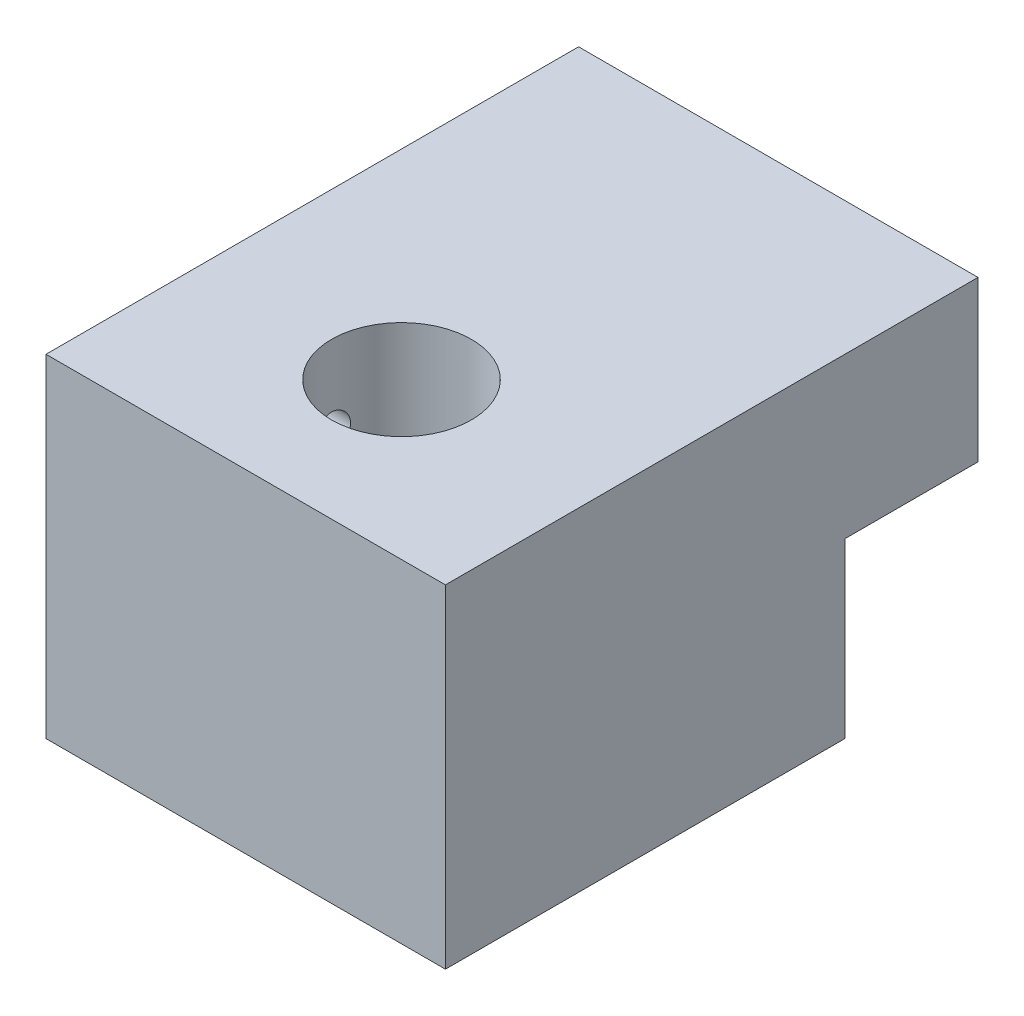
ISO-10303-21;
HEADER;
FILE_DESCRIPTION(('STEP AP214'),'2;1');
FILE_NAME('part.step','',(''),(''),'','','');
FILE_SCHEMA(('AUTOMOTIVE_DESIGN { 1 0 10303 214 1 1 1 1 }'));
ENDSEC;
DATA;
#1=APPLICATION_CONTEXT('core data for automotive mechanical design processes');
#2=APPLICATION_PROTOCOL_DEFINITION('international standard','automotive_design',2000,#1);
#3=PRODUCT_CONTEXT('',#1,'mechanical');
#4=PRODUCT('Part','Part','',(#3));
#5=PRODUCT_RELATED_PRODUCT_CATEGORY('part','',(#4));
#6=PRODUCT_DEFINITION_FORMATION('','',#4);
#7=PRODUCT_DEFINITION_CONTEXT('part definition',#1,'design');
#8=PRODUCT_DEFINITION('design','',#6,#7);
#9=PRODUCT_DEFINITION_SHAPE('','',#8);
#10=(LENGTH_UNIT() NAMED_UNIT(*) SI_UNIT(.MILLI.,.METRE.));
#11=(NAMED_UNIT(*) PLANE_ANGLE_UNIT() SI_UNIT($,.RADIAN.));
#12=(NAMED_UNIT(*) SI_UNIT($,.STERADIAN.) SOLID_ANGLE_UNIT());
#13=UNCERTAINTY_MEASURE_WITH_UNIT(LENGTH_MEASURE(1.E-05),#10,'distance_accuracy_value','');
#14=(GEOMETRIC_REPRESENTATION_CONTEXT(3) GLOBAL_UNCERTAINTY_ASSIGNED_CONTEXT((#13)) GLOBAL_UNIT_ASSIGNED_CONTEXT((#10,
#11,#12)) REPRESENTATION_CONTEXT('',''));
#15=CARTESIAN_POINT('',(0.,0.,0.));
#16=DIRECTION('',(0.,0.,1.));
#17=DIRECTION('',(1.,0.,0.));
#18=AXIS2_PLACEMENT_3D('',#15,#16,#17);
#19=CARTESIAN_POINT('',(-15.,-6.,40.));
#20=DIRECTION('',(0.,1.,0.));
#21=DIRECTION('',(0.,0.,1.));
#22=AXIS2_PLACEMENT_3D('',#19,#20,#21);
#23=PLANE('',#22);
#24=DIRECTION('',(1.,0.,0.));
#25=VECTOR('',#24,1.);
#26=CARTESIAN_POINT('',(-15.,-6.,10.));
#27=LINE('',#26,#25);
#28=CARTESIAN_POINT('',(-15.,-6.,10.));
#29=VERTEX_POINT('',#28);
#30=CARTESIAN_POINT('',(15.,-6.,10.));
#31=VERTEX_POINT('',#30);
#32=EDGE_CURVE('E73',#29,#31,#27,.T.);
#33=ORIENTED_EDGE('',*,*,#32,.F.);
#34=DIRECTION('',(0.,0.,-1.));
#35=VECTOR('',#34,1.);
#36=CARTESIAN_POINT('',(-15.,-6.,40.));
#37=LINE('',#36,#35);
#38=CARTESIAN_POINT('',(-15.,-6.,0.));
#39=VERTEX_POINT('',#38);
#40=EDGE_CURVE('E109',#29,#39,#37,.T.);
#41=ORIENTED_EDGE('',*,*,#40,.T.);
#42=DIRECTION('',(1.,0.,0.));
#43=VECTOR('',#42,1.);
#44=CARTESIAN_POINT('',(-15.,-6.,0.));
#45=LINE('',#44,#43);
#46=CARTESIAN_POINT('',(15.,-6.,0.));
#47=VERTEX_POINT('',#46);
#48=EDGE_CURVE('E113',#39,#47,#45,.T.);
#49=ORIENTED_EDGE('',*,*,#48,.T.);
#50=DIRECTION('',(0.,0.,-1.));
#51=VECTOR('',#50,1.);
#52=CARTESIAN_POINT('',(15.,-6.,40.));
#53=LINE('',#52,#51);
#54=EDGE_CURVE('E100',#31,#47,#53,.T.);
#55=ORIENTED_EDGE('',*,*,#54,.F.);
#56=EDGE_LOOP('',(#33,#41,#49,#55));
#57=FACE_BOUND('',#56,.T.);
#58=ADVANCED_FACE('F51',(#57),#23,.F.);
#59=CARTESIAN_POINT('',(15.,6.,40.));
#60=DIRECTION('',(-1.,0.,0.));
#61=DIRECTION('',(0.,0.,1.));
#62=AXIS2_PLACEMENT_3D('',#59,#60,#61);
#63=PLANE('',#62);
#64=DIRECTION('',(0.,1.,0.));
#65=VECTOR('',#64,1.);
#66=CARTESIAN_POINT('',(15.,6.,0.));
#67=LINE('',#66,#65);
#68=CARTESIAN_POINT('',(15.,6.,0.));
#69=VERTEX_POINT('',#68);
#70=EDGE_CURVE('E104',#47,#69,#67,.T.);
#71=ORIENTED_EDGE('',*,*,#70,.T.);
#72=DIRECTION('',(0.,0.,-1.));
#73=VECTOR('',#72,1.);
#74=CARTESIAN_POINT('',(15.,6.,40.));
#75=LINE('',#74,#73);
#76=CARTESIAN_POINT('',(15.,6.,40.));
#77=VERTEX_POINT('',#76);
#78=EDGE_CURVE('E11',#77,#69,#75,.T.);
#79=ORIENTED_EDGE('',*,*,#78,.F.);
#80=DIRECTION('',(0.,1.,0.));
#81=VECTOR('',#80,1.);
#82=CARTESIAN_POINT('',(15.,6.,40.));
#83=LINE('',#82,#81);
#84=CARTESIAN_POINT('',(15.,-19.,40.));
#85=VERTEX_POINT('',#84);
#86=EDGE_CURVE('E117',#85,#77,#83,.T.);
#87=ORIENTED_EDGE('',*,*,#86,.F.);
#88=DIRECTION('',(0.,0.,1.));
#89=VECTOR('',#88,1.);
#90=CARTESIAN_POINT('',(15.,-19.,40.));
#91=LINE('',#90,#89);
#92=CARTESIAN_POINT('',(15.,-19.,10.));
#93=VERTEX_POINT('',#92);
#94=EDGE_CURVE('E231',#93,#85,#91,.T.);
#95=ORIENTED_EDGE('',*,*,#94,.F.);
#96=DIRECTION('',(0.,1.,0.));
#97=VECTOR('',#96,1.);
#98=CARTESIAN_POINT('',(15.,-19.,10.));
#99=LINE('',#98,#97);
#100=EDGE_CURVE('E108',#93,#31,#99,.T.);
#101=ORIENTED_EDGE('',*,*,#100,.T.);
#102=ORIENTED_EDGE('',*,*,#54,.T.);
#103=EDGE_LOOP('',(#71,#79,#87,#95,#101,#102));
#104=FACE_BOUND('',#103,.T.);
#105=ADVANCED_FACE('F53',(#104),#63,.F.);
#106=CARTESIAN_POINT('',(-15.,6.,40.));
#107=DIRECTION('',(0.,-1.,0.));
#108=DIRECTION('',(0.,0.,-1.));
#109=AXIS2_PLACEMENT_3D('',#106,#107,#108);
#110=PLANE('',#109);
#111=CARTESIAN_POINT('',(0.,6.,28.3));
#112=DIRECTION('',(0.,1.,0.));
#113=DIRECTION('',(0.,0.,1.));
#114=AXIS2_PLACEMENT_3D('',#111,#112,#113);
#115=CIRCLE('',#114,5.25);
#116=CARTESIAN_POINT('',(0.,6.,33.55));
#117=VERTEX_POINT('',#116);
#118=EDGE_CURVE('E122',#117,#117,#115,.T.);
#119=ORIENTED_EDGE('',*,*,#118,.F.);
#120=EDGE_LOOP('',(#119));
#121=FACE_BOUND('',#120,.T.);
#122=DIRECTION('',(-1.,0.,0.));
#123=VECTOR('',#122,1.);
#124=CARTESIAN_POINT('',(-15.,6.,0.));
#125=LINE('',#124,#123);
#126=CARTESIAN_POINT('',(-15.,6.,0.));
#127=VERTEX_POINT('',#126);
#128=EDGE_CURVE('E121',#69,#127,#125,.T.);
#129=ORIENTED_EDGE('',*,*,#128,.T.);
#130=DIRECTION('',(0.,0.,-1.));
#131=VECTOR('',#130,1.);
#132=CARTESIAN_POINT('',(-15.,6.,40.));
#133=LINE('',#132,#131);
#134=CARTESIAN_POINT('',(-15.,6.,40.));
#135=VERTEX_POINT('',#134);
#136=EDGE_CURVE('E65',#135,#127,#133,.T.);
#137=ORIENTED_EDGE('',*,*,#136,.F.);
#138=DIRECTION('',(-1.,0.,0.));
#139=VECTOR('',#138,1.);
#140=CARTESIAN_POINT('',(-15.,6.,40.));
#141=LINE('',#140,#139);
#142=EDGE_CURVE('E82',#77,#135,#141,.T.);
#143=ORIENTED_EDGE('',*,*,#142,.F.);
#144=ORIENTED_EDGE('',*,*,#78,.T.);
#145=EDGE_LOOP('',(#129,#137,#143,#144));
#146=FACE_BOUND('',#145,.T.);
#147=ADVANCED_FACE('F189',(#121,#146),#110,.F.);
#148=CARTESIAN_POINT('',(-15.,6.,40.));
#149=DIRECTION('',(1.,0.,0.));
#150=DIRECTION('',(0.,0.,-1.));
#151=AXIS2_PLACEMENT_3D('',#148,#149,#150);
#152=PLANE('',#151);
#153=CARTESIAN_POINT('',(-15.,0.,28.3));
#154=DIRECTION('',(-1.,0.,0.));
#155=DIRECTION('',(0.,0.,1.));
#156=AXIS2_PLACEMENT_3D('',#153,#154,#155);
#157=CIRCLE('',#156,1.26999999999999);
#158=CARTESIAN_POINT('',(-15.,0.,29.57));
#159=VERTEX_POINT('',#158);
#160=EDGE_CURVE('E242',#159,#159,#157,.T.);
#161=ORIENTED_EDGE('',*,*,#160,.F.);
#162=EDGE_LOOP('',(#161));
#163=FACE_BOUND('',#162,.T.);
#164=CARTESIAN_POINT('',(-15.,-12.,28.3));
#165=DIRECTION('',(-1.,0.,0.));
#166=DIRECTION('',(0.,0.,1.));
#167=AXIS2_PLACEMENT_3D('',#164,#165,#166);
#168=CIRCLE('',#167,1.26999999999999);
#169=CARTESIAN_POINT('',(-15.,-12.,29.57));
#170=VERTEX_POINT('',#169);
#171=EDGE_CURVE('E141',#170,#170,#168,.T.);
#172=ORIENTED_EDGE('',*,*,#171,.F.);
#173=EDGE_LOOP('',(#172));
#174=FACE_BOUND('',#173,.T.);
#175=DIRECTION('',(0.,-1.,0.));
#176=VECTOR('',#175,1.);
#177=CARTESIAN_POINT('',(-15.,6.,0.));
#178=LINE('',#177,#176);
#179=EDGE_CURVE('E118',#127,#39,#178,.T.);
#180=ORIENTED_EDGE('',*,*,#179,.T.);
#181=ORIENTED_EDGE('',*,*,#40,.F.);
#182=DIRECTION('',(0.,1.,0.));
#183=VECTOR('',#182,1.);
#184=CARTESIAN_POINT('',(-15.,-19.,10.));
#185=LINE('',#184,#183);
#186=CARTESIAN_POINT('',(-15.,-19.,10.));
#187=VERTEX_POINT('',#186);
#188=EDGE_CURVE('E224',#187,#29,#185,.T.);
#189=ORIENTED_EDGE('',*,*,#188,.F.);
#190=DIRECTION('',(0.,0.,-1.));
#191=VECTOR('',#190,1.);
#192=CARTESIAN_POINT('',(-15.,-19.,40.));
#193=LINE('',#192,#191);
#194=CARTESIAN_POINT('',(-15.,-19.,40.));
#195=VERTEX_POINT('',#194);
#196=EDGE_CURVE('E208',#195,#187,#193,.T.);
#197=ORIENTED_EDGE('',*,*,#196,.F.);
#198=DIRECTION('',(0.,-1.,0.));
#199=VECTOR('',#198,1.);
#200=CARTESIAN_POINT('',(-15.,6.,40.));
#201=LINE('',#200,#199);
#202=EDGE_CURVE('E110',#135,#195,#201,.T.);
#203=ORIENTED_EDGE('',*,*,#202,.F.);
#204=ORIENTED_EDGE('',*,*,#136,.T.);
#205=EDGE_LOOP('',(#180,#181,#189,#197,#203,#204));
#206=FACE_BOUND('',#205,.T.);
#207=ADVANCED_FACE('F192',(#163,#174,#206),#152,.F.);
#208=CARTESIAN_POINT('',(0.,0.,40.));
#209=DIRECTION('',(0.,0.,1.));
#210=DIRECTION('',(1.,0.,0.));
#211=AXIS2_PLACEMENT_3D('',#208,#209,#210);
#212=PLANE('',#211);
#213=ORIENTED_EDGE('',*,*,#86,.T.);
#214=ORIENTED_EDGE('',*,*,#142,.T.);
#215=ORIENTED_EDGE('',*,*,#202,.T.);
#216=DIRECTION('',(-1.,0.,0.));
#217=VECTOR('',#216,1.);
#218=CARTESIAN_POINT('',(-15.,-19.,40.));
#219=LINE('',#218,#217);
#220=EDGE_CURVE('E228',#85,#195,#219,.T.);
#221=ORIENTED_EDGE('',*,*,#220,.F.);
#222=EDGE_LOOP('',(#213,#214,#215,#221));
#223=FACE_BOUND('',#222,.T.);
#224=ADVANCED_FACE('F194',(#223),#212,.T.);
#225=CARTESIAN_POINT('',(0.,0.,0.));
#226=DIRECTION('',(0.,0.,1.));
#227=DIRECTION('',(1.,0.,0.));
#228=AXIS2_PLACEMENT_3D('',#225,#226,#227);
#229=PLANE('',#228);
#230=CARTESIAN_POINT('',(-10.,0.,0.));
#231=DIRECTION('',(0.,0.,-1.));
#232=DIRECTION('',(-1.,0.,0.));
#233=AXIS2_PLACEMENT_3D('',#230,#231,#232);
#234=CIRCLE('',#233,1.26999999999999);
#235=CARTESIAN_POINT('',(-11.27,0.,0.));
#236=VERTEX_POINT('',#235);
#237=EDGE_CURVE('E221',#236,#236,#234,.T.);
#238=ORIENTED_EDGE('',*,*,#237,.F.);
#239=EDGE_LOOP('',(#238));
#240=FACE_BOUND('',#239,.T.);
#241=CARTESIAN_POINT('',(10.,0.,0.));
#242=DIRECTION('',(0.,0.,-1.));
#243=DIRECTION('',(-1.,0.,0.));
#244=AXIS2_PLACEMENT_3D('',#241,#242,#243);
#245=CIRCLE('',#244,1.26999999999999);
#246=CARTESIAN_POINT('',(8.73000000000001,0.,0.));
#247=VERTEX_POINT('',#246);
#248=EDGE_CURVE('E215',#247,#247,#245,.T.);
#249=ORIENTED_EDGE('',*,*,#248,.F.);
#250=EDGE_LOOP('',(#249));
#251=FACE_BOUND('',#250,.T.);
#252=ORIENTED_EDGE('',*,*,#70,.F.);
#253=ORIENTED_EDGE('',*,*,#48,.F.);
#254=ORIENTED_EDGE('',*,*,#179,.F.);
#255=ORIENTED_EDGE('',*,*,#128,.F.);
#256=EDGE_LOOP('',(#252,#253,#254,#255));
#257=FACE_BOUND('',#256,.T.);
#258=ADVANCED_FACE('F120',(#240,#251,#257),#229,.F.);
#259=CARTESIAN_POINT('',(0.,-6.,28.3));
#260=DIRECTION('',(0.,1.,0.));
#261=DIRECTION('',(0.,0.,1.));
#262=AXIS2_PLACEMENT_3D('',#259,#260,#261);
#263=CYLINDRICAL_SURFACE('',#262,5.25);
#264=CARTESIAN_POINT('',(-5.09407498963257,0.,29.57));
#265=CARTESIAN_POINT('',(-5.09407636725555,0.070207341668039,29.5699978803986));
#266=CARTESIAN_POINT('',(-5.09554224212027,0.140438655387468,29.5641584383468));
#267=CARTESIAN_POINT('',(-5.10123353869134,0.27888978026538,29.5409889963575));
#268=CARTESIAN_POINT('',(-5.10546067075263,0.347108317295833,29.5236518745213));
#269=CARTESIAN_POINT('',(-5.11616835403056,0.479511255104274,29.4780766884769));
#270=CARTESIAN_POINT('',(-5.12264611441559,0.543700536402292,29.4498521201994));
#271=CARTESIAN_POINT('',(-5.13712173487089,0.666438431181347,29.3833437241526));
#272=CARTESIAN_POINT('',(-5.14511963400191,0.724986899660441,29.345059637889));
#273=CARTESIAN_POINT('',(-5.16191886505499,0.835988377043344,29.2586763341547));
#274=CARTESIAN_POINT('',(-5.1707323592246,0.888307994378884,29.210408042896));
#275=CARTESIAN_POINT('',(-5.18806396069495,0.984193326638685,29.1057908974627));
#276=CARTESIAN_POINT('',(-5.19658204164648,1.02775826234698,29.0494413247729));
#277=CARTESIAN_POINT('',(-5.21249706713115,1.10543845873423,28.9293525570019));
#278=CARTESIAN_POINT('',(-5.21987798496784,1.13942341368687,28.8655267653419));
#279=CARTESIAN_POINT('',(-5.23254867181157,1.19613283973855,28.7328604278923));
#280=CARTESIAN_POINT('',(-5.23783872911763,1.21885886338883,28.6640205750196));
#281=CARTESIAN_POINT('',(-5.24564567884804,1.25198013687607,28.5246699443704));
#282=CARTESIAN_POINT('',(-5.2482134071178,1.26260171441101,28.4542158577608));
#283=CARTESIAN_POINT('',(-5.25046326065252,1.2719222594246,28.3124821519901));
#284=CARTESIAN_POINT('',(-5.25014578641428,1.27062288165841,28.2412026487773));
#285=CARTESIAN_POINT('',(-5.24669912185444,1.25630275037756,28.1014086037273));
#286=CARTESIAN_POINT('',(-5.24362851267181,1.24352619729002,28.0328673862428));
#287=CARTESIAN_POINT('',(-5.23508839549306,1.20700599811051,27.8989320754469));
#288=CARTESIAN_POINT('',(-5.22961876453035,1.18326178984643,27.8335381436465));
#289=CARTESIAN_POINT('',(-5.21680430670677,1.12527778825584,27.7071010196067));
#290=CARTESIAN_POINT('',(-5.20944377197423,1.09094956988744,27.6461000363709));
#291=CARTESIAN_POINT('',(-5.19364832997929,1.01283874639133,27.5306379635572));
#292=CARTESIAN_POINT('',(-5.18521324664115,0.969054590992555,27.4761779486313));
#293=CARTESIAN_POINT('',(-5.16793765063054,0.871959988409499,27.3738882234055));
#294=CARTESIAN_POINT('',(-5.15909228141297,0.818436018889859,27.3262618039438));
#295=CARTESIAN_POINT('',(-5.14219014332265,0.704068362720543,27.2406173418074));
#296=CARTESIAN_POINT('',(-5.13413340666358,0.643224377292486,27.2025996915267));
#297=CARTESIAN_POINT('',(-5.11970446370426,0.515564252138189,27.1371328474079));
#298=CARTESIAN_POINT('',(-5.11333963549477,0.448723601770641,27.1097297116754));
#299=CARTESIAN_POINT('',(-5.10311152543485,0.311193704222455,27.066610722916));
#300=CARTESIAN_POINT('',(-5.09924774670069,0.240505224517589,27.0508925483447));
#301=CARTESIAN_POINT('',(-5.0945627317216,0.0991640697505659,27.0319209375161));
#302=CARTESIAN_POINT('',(-5.09366844631812,0.0285539470537912,27.0283681640362));
#303=CARTESIAN_POINT('',(-5.09482531173249,-0.112250040616317,27.0330111545578));
#304=CARTESIAN_POINT('',(-5.09687621048496,-0.182443940696047,27.0412059131394));
#305=CARTESIAN_POINT('',(-5.10362263020232,-0.319330417070705,27.0688495948905));
#306=CARTESIAN_POINT('',(-5.10827777457407,-0.38605984576521,27.0881268171942));
#307=CARTESIAN_POINT('',(-5.11967035082008,-0.515340648402239,27.1371990684417));
#308=CARTESIAN_POINT('',(-5.12640801704769,-0.577891551156942,27.1669952811774));
#309=CARTESIAN_POINT('',(-5.14136207865132,-0.698315375864482,27.2368950869633));
#310=CARTESIAN_POINT('',(-5.14960351793957,-0.756080384721408,27.2771791193008));
#311=CARTESIAN_POINT('',(-5.16657386891164,-0.864140550084498,27.3666807725144));
#312=CARTESIAN_POINT('',(-5.17530285523183,-0.914434558552473,27.4158997638125));
#313=CARTESIAN_POINT('',(-5.19251050977272,-1.00732382479851,27.5232428303101));
#314=CARTESIAN_POINT('',(-5.2009786333451,-1.04971280489618,27.5815474051673));
#315=CARTESIAN_POINT('',(-5.21649940525039,-1.12409691146908,27.7046218153389));
#316=CARTESIAN_POINT('',(-5.22355212593822,-1.15609256929911,27.7693913199149));
#317=CARTESIAN_POINT('',(-5.23540388008446,-1.2085132586955,27.903117679569));
#318=CARTESIAN_POINT('',(-5.24021866546579,-1.22901937737627,27.9720412872092));
#319=CARTESIAN_POINT('',(-5.2471208032668,-1.25812539741438,28.1124872102015));
#320=CARTESIAN_POINT('',(-5.24920864639808,-1.26672744091938,28.1840090556208));
#321=CARTESIAN_POINT('',(-5.25040309767701,-1.27166709817214,28.3256780528173));
#322=CARTESIAN_POINT('',(-5.24958392827777,-1.26831004555806,28.3958140994847));
#323=CARTESIAN_POINT('',(-5.24521947878854,-1.25012171902101,28.5344909824814));
#324=CARTESIAN_POINT('',(-5.24167427051893,-1.23529074739057,28.603031860788));
#325=CARTESIAN_POINT('',(-5.2322659894712,-1.19473489209985,28.7362755783338));
#326=CARTESIAN_POINT('',(-5.2264139960307,-1.16906203983798,28.8009950875632));
#327=CARTESIAN_POINT('',(-5.21301058347889,-1.10759901297136,28.9252439860721));
#328=CARTESIAN_POINT('',(-5.20545896251182,-1.07180763651369,28.9847727577091));
#329=CARTESIAN_POINT('',(-5.18925946972923,-0.990174883533501,29.0984098140399));
#330=CARTESIAN_POINT('',(-5.18059064158845,-0.944124231876323,29.1523647808537));
#331=CARTESIAN_POINT('',(-5.1632327603563,-0.843690794370676,29.2518850445228));
#332=CARTESIAN_POINT('',(-5.15454370275704,-0.789305931787976,29.2974482440538));
#333=CARTESIAN_POINT('',(-5.13796026698273,-0.672623879433002,29.3796561596354));
#334=CARTESIAN_POINT('',(-5.13008209370079,-0.610206875688373,29.4161343259707));
#335=CARTESIAN_POINT('',(-5.11622618127938,-0.479945984113393,29.4780249432506));
#336=CARTESIAN_POINT('',(-5.11024699770407,-0.412106270382412,29.5034458102169));
#337=CARTESIAN_POINT('',(-5.1018477355402,-0.286942281923545,29.5385081634183));
#338=CARTESIAN_POINT('',(-5.09895416278514,-0.230240553996195,29.5502927326123));
#339=CARTESIAN_POINT('',(-5.09506729244191,-0.115697921001232,29.5660392350725));
#340=CARTESIAN_POINT('',(-5.09407385434857,-0.0578571004832096,29.5700017467403));
#341=CARTESIAN_POINT('',(-5.09407498963257,0.,29.57));
#342=B_SPLINE_CURVE_WITH_KNOTS('',3,(#264,#265,#266,#267,#268,#269,#270,#271,#272,#273,#274,
#275,#276,#277,#278,#279,#280,#281,#282,#283,#284,#285,#286,#287,#288,#289,#290,#291,#292,#293,
#294,#295,#296,#297,#298,#299,#300,#301,#302,#303,#304,#305,#306,#307,#308,#309,#310,#311,#312,
#313,#314,#315,#316,#317,#318,#319,#320,#321,#322,#323,#324,#325,#326,#327,#328,#329,#330,#331,
#332,#333,#334,#335,#336,#337,#338,#339,#340,#341),.UNSPECIFIED.,.T.,.F.,(4,2,2,2,2,2,2,2,2,2,2,
2,2,2,2,2,2,2,2,2,2,2,2,2,2,2,2,2,2,2,2,2,2,2,2,2,2,2,4),(0.,0.210409677660963,
0.420949809274477,0.631229792543925,0.841515179799743,1.05570578901423,1.26991545396373,
1.48691181762188,1.70387825021486,1.91671764528805,2.12952749644039,2.33791390905346,
2.54631100417146,2.75649864363914,2.96672076890237,3.18227684567801,3.3978417237132,
3.61433176578774,3.83077878455325,4.04186015820061,4.25292346739744,4.46080165675559,
4.66870324788373,4.88044990058293,5.09222905794245,5.30893407809456,5.52562801753752,
5.74077273503031,5.95587873202578,6.16553255196636,6.37518084854329,6.58383425250156,
6.79251245020742,7.00591731838956,7.21937544992268,7.43649839117697,7.65345578363485,
7.82686491517385,8.00026122350626),.UNSPECIFIED.);
#343=CARTESIAN_POINT('',(-5.09407498963257,0.,29.57));
#344=VERTEX_POINT('',#343);
#345=EDGE_CURVE('E55',#344,#344,#342,.T.);
#346=ORIENTED_EDGE('',*,*,#345,.T.);
#347=EDGE_LOOP('',(#346));
#348=FACE_BOUND('',#347,.T.);
#349=CARTESIAN_POINT('',(-5.09407498963257,-12.,29.57));
#350=CARTESIAN_POINT('',(-5.09407636725555,-11.929792658332,29.5699978803986));
#351=CARTESIAN_POINT('',(-5.09554224212027,-11.8595613446125,29.5641584383468));
#352=CARTESIAN_POINT('',(-5.10123353869134,-11.7211102197346,29.5409889963575));
#353=CARTESIAN_POINT('',(-5.10546067075263,-11.6528916827042,29.5236518745213));
#354=CARTESIAN_POINT('',(-5.11616835403056,-11.5204887448957,29.4780766884769));
#355=CARTESIAN_POINT('',(-5.12264611441559,-11.4562994635977,29.4498521201994));
#356=CARTESIAN_POINT('',(-5.13712173487089,-11.3335615688187,29.3833437241526));
#357=CARTESIAN_POINT('',(-5.14511963400191,-11.2750131003396,29.345059637889));
#358=CARTESIAN_POINT('',(-5.16191886505499,-11.1640116229567,29.2586763341547));
#359=CARTESIAN_POINT('',(-5.1707323592246,-11.1116920056211,29.210408042896));
#360=CARTESIAN_POINT('',(-5.18806396069495,-11.0158066733613,29.1057908974627));
#361=CARTESIAN_POINT('',(-5.19658204164648,-10.972241737653,29.0494413247729));
#362=CARTESIAN_POINT('',(-5.21249706713115,-10.8945615412658,28.9293525570019));
#363=CARTESIAN_POINT('',(-5.21987798496784,-10.8605765863131,28.8655267653419));
#364=CARTESIAN_POINT('',(-5.23254867181157,-10.8038671602614,28.7328604278923));
#365=CARTESIAN_POINT('',(-5.23783872911763,-10.7811411366112,28.6640205750196));
#366=CARTESIAN_POINT('',(-5.24564567884804,-10.7480198631239,28.5246699443704));
#367=CARTESIAN_POINT('',(-5.2482134071178,-10.737398285589,28.4542158577608));
#368=CARTESIAN_POINT('',(-5.25046326065252,-10.7280777405754,28.3124821519901));
#369=CARTESIAN_POINT('',(-5.25014578641428,-10.7293771183416,28.2412026487773));
#370=CARTESIAN_POINT('',(-5.24669912185444,-10.7436972496224,28.1014086037273));
#371=CARTESIAN_POINT('',(-5.24362851267181,-10.75647380271,28.0328673862428));
#372=CARTESIAN_POINT('',(-5.23508839549306,-10.7929940018895,27.8989320754469));
#373=CARTESIAN_POINT('',(-5.22961876453035,-10.8167382101536,27.8335381436465));
#374=CARTESIAN_POINT('',(-5.21680430670677,-10.8747222117442,27.7071010196067));
#375=CARTESIAN_POINT('',(-5.20944377197423,-10.9090504301126,27.6461000363709));
#376=CARTESIAN_POINT('',(-5.1936483299793,-10.9871612536087,27.5306379635572));
#377=CARTESIAN_POINT('',(-5.18521324664115,-11.0309454090074,27.4761779486313));
#378=CARTESIAN_POINT('',(-5.16793765063054,-11.1280400115905,27.3738882234055));
#379=CARTESIAN_POINT('',(-5.15909228141297,-11.1815639811101,27.3262618039438));
#380=CARTESIAN_POINT('',(-5.14219014332265,-11.2959316372795,27.2406173418074));
#381=CARTESIAN_POINT('',(-5.13413340666358,-11.3567756227075,27.2025996915267));
#382=CARTESIAN_POINT('',(-5.11970446370426,-11.4844357478618,27.1371328474079));
#383=CARTESIAN_POINT('',(-5.11333963549477,-11.5512763982294,27.1097297116754));
#384=CARTESIAN_POINT('',(-5.10311152543485,-11.6888062957775,27.066610722916));
#385=CARTESIAN_POINT('',(-5.09924774670069,-11.7594947754824,27.0508925483447));
#386=CARTESIAN_POINT('',(-5.0945627317216,-11.9008359302494,27.0319209375161));
#387=CARTESIAN_POINT('',(-5.09366844631812,-11.9714460529462,27.0283681640362));
#388=CARTESIAN_POINT('',(-5.09482531173249,-12.1122500406163,27.0330111545578));
#389=CARTESIAN_POINT('',(-5.09687621048496,-12.182443940696,27.0412059131394));
#390=CARTESIAN_POINT('',(-5.10362263020232,-12.3193304170707,27.0688495948905));
#391=CARTESIAN_POINT('',(-5.10827777457407,-12.3860598457652,27.0881268171942));
#392=CARTESIAN_POINT('',(-5.11967035082008,-12.5153406484022,27.1371990684417));
#393=CARTESIAN_POINT('',(-5.12640801704769,-12.5778915511569,27.1669952811774));
#394=CARTESIAN_POINT('',(-5.14136207865132,-12.6983153758645,27.2368950869633));
#395=CARTESIAN_POINT('',(-5.14960351793957,-12.7560803847214,27.2771791193008));
#396=CARTESIAN_POINT('',(-5.16657386891164,-12.8641405500845,27.3666807725144));
#397=CARTESIAN_POINT('',(-5.17530285523183,-12.9144345585525,27.4158997638125));
#398=CARTESIAN_POINT('',(-5.19251050977272,-13.0073238247985,27.5232428303101));
#399=CARTESIAN_POINT('',(-5.2009786333451,-13.0497128048962,27.5815474051673));
#400=CARTESIAN_POINT('',(-5.21649940525039,-13.1240969114691,27.7046218153389));
#401=CARTESIAN_POINT('',(-5.22355212593822,-13.1560925692991,27.7693913199149));
#402=CARTESIAN_POINT('',(-5.23540388008446,-13.2085132586955,27.903117679569));
#403=CARTESIAN_POINT('',(-5.24021866546579,-13.2290193773763,27.9720412872092));
#404=CARTESIAN_POINT('',(-5.2471208032668,-13.2581253974144,28.1124872102015));
#405=CARTESIAN_POINT('',(-5.24920864639808,-13.2667274409194,28.1840090556208));
#406=CARTESIAN_POINT('',(-5.25040309767701,-13.2716670981721,28.3256780528173));
#407=CARTESIAN_POINT('',(-5.24958392827777,-13.2683100455581,28.3958140994847));
#408=CARTESIAN_POINT('',(-5.24521947878854,-13.250121719021,28.5344909824814));
#409=CARTESIAN_POINT('',(-5.24167427051893,-13.2352907473906,28.603031860788));
#410=CARTESIAN_POINT('',(-5.2322659894712,-13.1947348920998,28.7362755783338));
#411=CARTESIAN_POINT('',(-5.2264139960307,-13.169062039838,28.8009950875632));
#412=CARTESIAN_POINT('',(-5.21301058347889,-13.1075990129714,28.9252439860721));
#413=CARTESIAN_POINT('',(-5.20545896251182,-13.0718076365137,28.9847727577091));
#414=CARTESIAN_POINT('',(-5.18925946972923,-12.9901748835335,29.0984098140399));
#415=CARTESIAN_POINT('',(-5.18059064158845,-12.9441242318763,29.1523647808537));
#416=CARTESIAN_POINT('',(-5.1632327603563,-12.8436907943707,29.2518850445228));
#417=CARTESIAN_POINT('',(-5.15454370275704,-12.789305931788,29.2974482440538));
#418=CARTESIAN_POINT('',(-5.13796026698273,-12.672623879433,29.3796561596354));
#419=CARTESIAN_POINT('',(-5.13008209370079,-12.6102068756884,29.4161343259707));
#420=CARTESIAN_POINT('',(-5.11622618127938,-12.4799459841134,29.4780249432506));
#421=CARTESIAN_POINT('',(-5.11024699770407,-12.4121062703824,29.5034458102169));
#422=CARTESIAN_POINT('',(-5.1018477355402,-12.2869422819235,29.5385081634183));
#423=CARTESIAN_POINT('',(-5.09895416278514,-12.2302405539962,29.5502927326123));
#424=CARTESIAN_POINT('',(-5.09506729244191,-12.1156979210012,29.5660392350725));
#425=CARTESIAN_POINT('',(-5.09407385434857,-12.0578571004832,29.5700017467403));
#426=CARTESIAN_POINT('',(-5.09407498963257,-12.,29.57));
#427=B_SPLINE_CURVE_WITH_KNOTS('',3,(#349,#350,#351,#352,#353,#354,#355,#356,#357,#358,#359,
#360,#361,#362,#363,#364,#365,#366,#367,#368,#369,#370,#371,#372,#373,#374,#375,#376,#377,#378,
#379,#380,#381,#382,#383,#384,#385,#386,#387,#388,#389,#390,#391,#392,#393,#394,#395,#396,#397,
#398,#399,#400,#401,#402,#403,#404,#405,#406,#407,#408,#409,#410,#411,#412,#413,#414,#415,#416,
#417,#418,#419,#420,#421,#422,#423,#424,#425,#426),.UNSPECIFIED.,.T.,.F.,(4,2,2,2,2,2,2,2,2,2,2,
2,2,2,2,2,2,2,2,2,2,2,2,2,2,2,2,2,2,2,2,2,2,2,2,2,2,2,4),(0.,0.210409677660963,
0.420949809274478,0.631229792543926,0.841515179799742,1.05570578901423,1.26991545396373,
1.48691181762188,1.70387825021486,1.91671764528805,2.12952749644039,2.33791390905346,
2.54631100417146,2.75649864363914,2.96672076890237,3.18227684567801,3.3978417237132,
3.61433176578774,3.83077878455325,4.04186015820061,4.25292346739744,4.46080165675559,
4.66870324788373,4.88044990058293,5.09222905794245,5.30893407809456,5.52562801753752,
5.7407727350303,5.95587873202578,6.16553255196636,6.37518084854329,6.58383425250156,
6.79251245020742,7.00591731838956,7.21937544992268,7.43649839117698,7.65345578363485,
7.82686491517386,8.00026122350626),.UNSPECIFIED.);
#428=CARTESIAN_POINT('',(-5.09407498963257,-12.,29.57));
#429=VERTEX_POINT('',#428);
#430=EDGE_CURVE('E134',#429,#429,#427,.T.);
#431=ORIENTED_EDGE('',*,*,#430,.T.);
#432=EDGE_LOOP('',(#431));
#433=FACE_BOUND('',#432,.T.);
#434=ORIENTED_EDGE('',*,*,#118,.T.);
#435=EDGE_LOOP('',(#434));
#436=FACE_BOUND('',#435,.T.);
#437=CARTESIAN_POINT('',(0.,-19.,28.3));
#438=DIRECTION('',(0.,-1.,0.));
#439=DIRECTION('',(0.,0.,-1.));
#440=AXIS2_PLACEMENT_3D('',#437,#438,#439);
#441=CIRCLE('',#440,5.25);
#442=CARTESIAN_POINT('',(0.,-19.,23.05));
#443=VERTEX_POINT('',#442);
#444=EDGE_CURVE('E140',#443,#443,#441,.T.);
#445=ORIENTED_EDGE('',*,*,#444,.T.);
#446=EDGE_LOOP('',(#445));
#447=FACE_BOUND('',#446,.T.);
#448=ADVANCED_FACE('F142',(#348,#433,#436,#447),#263,.F.);
#449=CARTESIAN_POINT('',(10.,0.,10.));
#450=DIRECTION('',(0.,0.,-1.));
#451=DIRECTION('',(-1.,0.,0.));
#452=AXIS2_PLACEMENT_3D('',#449,#450,#451);
#453=CONICAL_SURFACE('',#452,1.27,1.02974425867665);
#454=CARTESIAN_POINT('',(10.,0.,10.763092986165));
#455=VERTEX_POINT('',#454);
#456=VERTEX_LOOP('',#455);
#457=FACE_BOUND('',#456,.T.);
#458=CARTESIAN_POINT('',(10.,0.,10.));
#459=DIRECTION('',(0.,0.,-1.));
#460=DIRECTION('',(-1.,0.,0.));
#461=AXIS2_PLACEMENT_3D('',#458,#459,#460);
#462=CIRCLE('',#461,1.27);
#463=CARTESIAN_POINT('',(8.73,0.,10.));
#464=VERTEX_POINT('',#463);
#465=EDGE_CURVE('E126',#464,#464,#462,.T.);
#466=ORIENTED_EDGE('',*,*,#465,.T.);
#467=EDGE_LOOP('',(#466));
#468=FACE_BOUND('',#467,.T.);
#469=ADVANCED_FACE('F171',(#457,#468),#453,.F.);
#470=CARTESIAN_POINT('',(10.,0.,0.));
#471=DIRECTION('',(0.,0.,-1.));
#472=DIRECTION('',(-1.,0.,0.));
#473=AXIS2_PLACEMENT_3D('',#470,#471,#472);
#474=CYLINDRICAL_SURFACE('',#473,1.26999999999999);
#475=ORIENTED_EDGE('',*,*,#465,.F.);
#476=EDGE_LOOP('',(#475));
#477=FACE_BOUND('',#476,.T.);
#478=ORIENTED_EDGE('',*,*,#248,.T.);
#479=EDGE_LOOP('',(#478));
#480=FACE_BOUND('',#479,.T.);
#481=ADVANCED_FACE('F168',(#477,#480),#474,.F.);
#482=CARTESIAN_POINT('',(-10.,0.,10.));
#483=DIRECTION('',(0.,0.,-1.));
#484=DIRECTION('',(-1.,0.,0.));
#485=AXIS2_PLACEMENT_3D('',#482,#483,#484);
#486=CONICAL_SURFACE('',#485,1.27,1.02974425867665);
#487=CARTESIAN_POINT('',(-10.,0.,10.763092986165));
#488=VERTEX_POINT('',#487);
#489=VERTEX_LOOP('',#488);
#490=FACE_BOUND('',#489,.T.);
#491=CARTESIAN_POINT('',(-10.,0.,10.));
#492=DIRECTION('',(0.,0.,-1.));
#493=DIRECTION('',(-1.,0.,0.));
#494=AXIS2_PLACEMENT_3D('',#491,#492,#493);
#495=CIRCLE('',#494,1.27);
#496=CARTESIAN_POINT('',(-11.27,0.,10.));
#497=VERTEX_POINT('',#496);
#498=EDGE_CURVE('E218',#497,#497,#495,.T.);
#499=ORIENTED_EDGE('',*,*,#498,.T.);
#500=EDGE_LOOP('',(#499));
#501=FACE_BOUND('',#500,.T.);
#502=ADVANCED_FACE('F164',(#490,#501),#486,.F.);
#503=CARTESIAN_POINT('',(-10.,0.,0.));
#504=DIRECTION('',(0.,0.,-1.));
#505=DIRECTION('',(-1.,0.,0.));
#506=AXIS2_PLACEMENT_3D('',#503,#504,#505);
#507=CYLINDRICAL_SURFACE('',#506,1.26999999999999);
#508=ORIENTED_EDGE('',*,*,#498,.F.);
#509=EDGE_LOOP('',(#508));
#510=FACE_BOUND('',#509,.T.);
#511=ORIENTED_EDGE('',*,*,#237,.T.);
#512=EDGE_LOOP('',(#511));
#513=FACE_BOUND('',#512,.T.);
#514=ADVANCED_FACE('F157',(#510,#513),#507,.F.);
#515=CARTESIAN_POINT('',(0.,-19.,0.));
#516=DIRECTION('',(0.,-1.,0.));
#517=DIRECTION('',(0.,0.,-1.));
#518=AXIS2_PLACEMENT_3D('',#515,#516,#517);
#519=PLANE('',#518);
#520=ORIENTED_EDGE('',*,*,#196,.T.);
#521=DIRECTION('',(1.,0.,0.));
#522=VECTOR('',#521,1.);
#523=CARTESIAN_POINT('',(-15.,-19.,10.));
#524=LINE('',#523,#522);
#525=EDGE_CURVE('E234',#187,#93,#524,.T.);
#526=ORIENTED_EDGE('',*,*,#525,.T.);
#527=ORIENTED_EDGE('',*,*,#94,.T.);
#528=ORIENTED_EDGE('',*,*,#220,.T.);
#529=EDGE_LOOP('',(#520,#526,#527,#528));
#530=FACE_BOUND('',#529,.T.);
#531=ORIENTED_EDGE('',*,*,#444,.F.);
#532=EDGE_LOOP('',(#531));
#533=FACE_BOUND('',#532,.T.);
#534=ADVANCED_FACE('F154',(#530,#533),#519,.T.);
#535=CARTESIAN_POINT('',(-15.,-19.,10.));
#536=DIRECTION('',(0.,0.,1.));
#537=DIRECTION('',(1.,0.,0.));
#538=AXIS2_PLACEMENT_3D('',#535,#536,#537);
#539=PLANE('',#538);
#540=ORIENTED_EDGE('',*,*,#32,.T.);
#541=ORIENTED_EDGE('',*,*,#100,.F.);
#542=ORIENTED_EDGE('',*,*,#525,.F.);
#543=ORIENTED_EDGE('',*,*,#188,.T.);
#544=EDGE_LOOP('',(#540,#541,#542,#543));
#545=FACE_BOUND('',#544,.T.);
#546=ADVANCED_FACE('F151',(#545),#539,.F.);
#547=CARTESIAN_POINT('',(-15.,-12.,28.3));
#548=DIRECTION('',(-1.,0.,0.));
#549=DIRECTION('',(0.,0.,1.));
#550=AXIS2_PLACEMENT_3D('',#547,#548,#549);
#551=CYLINDRICAL_SURFACE('',#550,1.26999999999999);
#552=ORIENTED_EDGE('',*,*,#171,.T.);
#553=EDGE_LOOP('',(#552));
#554=FACE_BOUND('',#553,.T.);
#555=ORIENTED_EDGE('',*,*,#430,.F.);
#556=EDGE_LOOP('',(#555));
#557=FACE_BOUND('',#556,.T.);
#558=ADVANCED_FACE('F146',(#554,#557),#551,.F.);
#559=CARTESIAN_POINT('',(-15.,0.,28.3));
#560=DIRECTION('',(-1.,0.,0.));
#561=DIRECTION('',(0.,0.,1.));
#562=AXIS2_PLACEMENT_3D('',#559,#560,#561);
#563=CYLINDRICAL_SURFACE('',#562,1.26999999999999);
#564=ORIENTED_EDGE('',*,*,#160,.T.);
#565=EDGE_LOOP('',(#564));
#566=FACE_BOUND('',#565,.T.);
#567=ORIENTED_EDGE('',*,*,#345,.F.);
#568=EDGE_LOOP('',(#567));
#569=FACE_BOUND('',#568,.T.);
#570=ADVANCED_FACE('F150',(#566,#569),#563,.F.);
#571=CLOSED_SHELL('',(#58,#105,#147,#207,#224,#258,#448,#469,#481,#502,#514,#534,#546,#558,#570));
#572=MANIFOLD_SOLID_BREP('B2',#571);
#573=ADVANCED_BREP_SHAPE_REPRESENTATION('',(#18,#572),#14);
#574=SHAPE_DEFINITION_REPRESENTATION(#9,#573);
ENDSEC;
END-ISO-10303-21;
